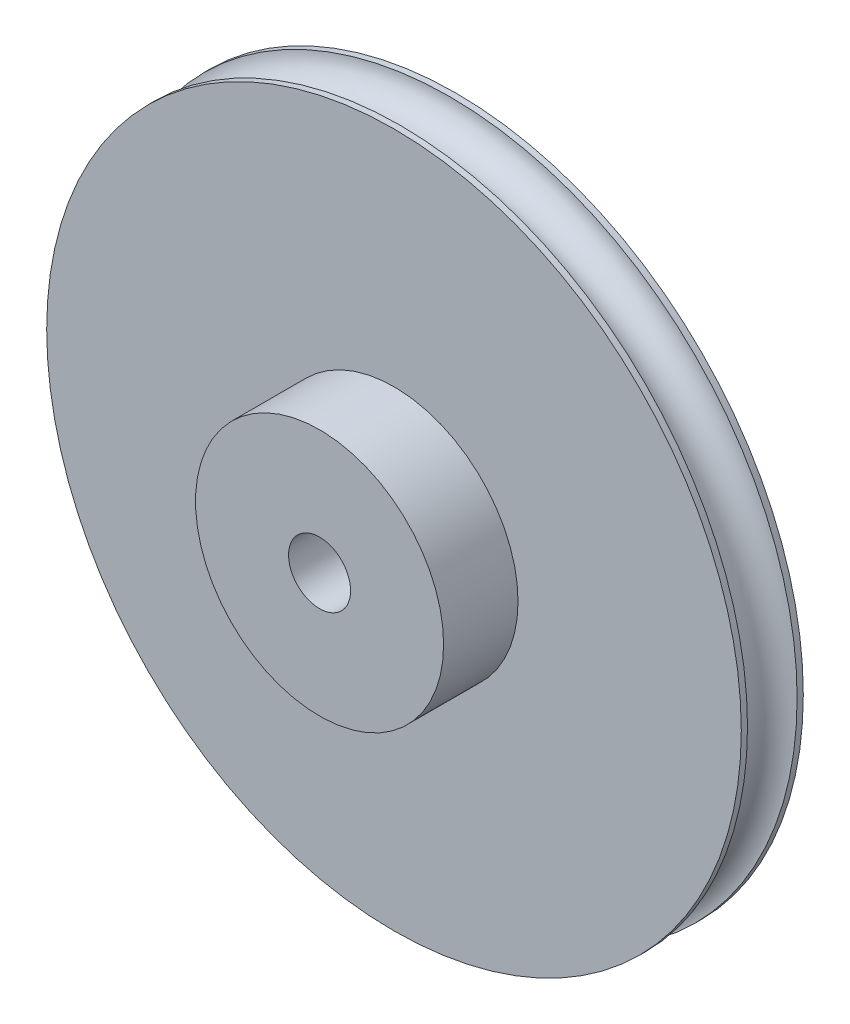
ISO-10303-21;
HEADER;
FILE_DESCRIPTION(('STEP AP214'),'2;1');
FILE_NAME('part.step','',(''),(''),'','','');
FILE_SCHEMA(('AUTOMOTIVE_DESIGN { 1 0 10303 214 1 1 1 1 }'));
ENDSEC;
DATA;
#1=APPLICATION_CONTEXT('core data for automotive mechanical design processes');
#2=APPLICATION_PROTOCOL_DEFINITION('international standard','automotive_design',2000,#1);
#3=PRODUCT_CONTEXT('',#1,'mechanical');
#4=PRODUCT('Part','Part','',(#3));
#5=PRODUCT_RELATED_PRODUCT_CATEGORY('part','',(#4));
#6=PRODUCT_DEFINITION_FORMATION('','',#4);
#7=PRODUCT_DEFINITION_CONTEXT('part definition',#1,'design');
#8=PRODUCT_DEFINITION('design','',#6,#7);
#9=PRODUCT_DEFINITION_SHAPE('','',#8);
#10=(LENGTH_UNIT() NAMED_UNIT(*) SI_UNIT(.MILLI.,.METRE.));
#11=(NAMED_UNIT(*) PLANE_ANGLE_UNIT() SI_UNIT($,.RADIAN.));
#12=(NAMED_UNIT(*) SI_UNIT($,.STERADIAN.) SOLID_ANGLE_UNIT());
#13=UNCERTAINTY_MEASURE_WITH_UNIT(LENGTH_MEASURE(1.E-05),#10,'distance_accuracy_value','');
#14=(GEOMETRIC_REPRESENTATION_CONTEXT(3) GLOBAL_UNCERTAINTY_ASSIGNED_CONTEXT((#13)) GLOBAL_UNIT_ASSIGNED_CONTEXT((#10,
#11,#12)) REPRESENTATION_CONTEXT('',''));
#15=CARTESIAN_POINT('',(0.,0.,0.));
#16=DIRECTION('',(0.,0.,1.));
#17=DIRECTION('',(1.,0.,0.));
#18=AXIS2_PLACEMENT_3D('',#15,#16,#17);
#19=CARTESIAN_POINT('',(0.,0.,5.));
#20=DIRECTION('',(0.,0.,-1.));
#21=DIRECTION('',(-1.,0.,0.));
#22=AXIS2_PLACEMENT_3D('',#19,#20,#21);
#23=CYLINDRICAL_SURFACE('',#22,28.);
#24=CARTESIAN_POINT('',(0.,0.,0.5));
#25=DIRECTION('',(0.,0.,1.));
#26=DIRECTION('',(1.,0.,0.));
#27=AXIS2_PLACEMENT_3D('',#24,#25,#26);
#28=CIRCLE('',#27,28.);
#29=CARTESIAN_POINT('',(28.,0.,0.5));
#30=VERTEX_POINT('',#29);
#31=EDGE_CURVE('E38',#30,#30,#28,.F.);
#32=ORIENTED_EDGE('',*,*,#31,.T.);
#33=EDGE_LOOP('',(#32));
#34=FACE_BOUND('',#33,.T.);
#35=CARTESIAN_POINT('',(0.,0.,0.));
#36=DIRECTION('',(0.,0.,1.));
#37=DIRECTION('',(1.,0.,0.));
#38=AXIS2_PLACEMENT_3D('',#35,#36,#37);
#39=CIRCLE('',#38,28.);
#40=CARTESIAN_POINT('',(28.,0.,0.));
#41=VERTEX_POINT('',#40);
#42=EDGE_CURVE('E47',#41,#41,#39,.T.);
#43=ORIENTED_EDGE('',*,*,#42,.T.);
#44=EDGE_LOOP('',(#43));
#45=FACE_BOUND('',#44,.T.);
#46=ADVANCED_FACE('F34',(#34,#45),#23,.T.);
#47=CARTESIAN_POINT('',(0.,0.,4.5));
#48=DIRECTION('',(0.,0.,-1.));
#49=DIRECTION('',(-1.,0.,0.));
#50=AXIS2_PLACEMENT_3D('',#47,#48,#49);
#51=CIRCLE('',#50,28.);
#52=CARTESIAN_POINT('',(-28.,0.,4.5));
#53=VERTEX_POINT('',#52);
#54=EDGE_CURVE('E54',#53,#53,#51,.F.);
#55=ORIENTED_EDGE('',*,*,#54,.T.);
#56=EDGE_LOOP('',(#55));
#57=FACE_BOUND('',#56,.T.);
#58=CARTESIAN_POINT('',(0.,0.,5.));
#59=DIRECTION('',(0.,0.,1.));
#60=DIRECTION('',(1.,0.,0.));
#61=AXIS2_PLACEMENT_3D('',#58,#59,#60);
#62=CIRCLE('',#61,28.);
#63=CARTESIAN_POINT('',(28.,0.,5.));
#64=VERTEX_POINT('',#63);
#65=EDGE_CURVE('E42',#64,#64,#62,.T.);
#66=ORIENTED_EDGE('',*,*,#65,.F.);
#67=EDGE_LOOP('',(#66));
#68=FACE_BOUND('',#67,.T.);
#69=ADVANCED_FACE('F36',(#57,#68),#23,.T.);
#70=CARTESIAN_POINT('',(0.,0.,5.));
#71=DIRECTION('',(0.,0.,1.));
#72=DIRECTION('',(1.,0.,0.));
#73=AXIS2_PLACEMENT_3D('',#70,#71,#72);
#74=PLANE('',#73);
#75=CARTESIAN_POINT('',(0.,0.,5.));
#76=DIRECTION('',(0.,0.,1.));
#77=DIRECTION('',(1.,0.,0.));
#78=AXIS2_PLACEMENT_3D('',#75,#76,#77);
#79=CIRCLE('',#78,10.);
#80=CARTESIAN_POINT('',(10.,0.,5.));
#81=VERTEX_POINT('',#80);
#82=EDGE_CURVE('E10',#81,#81,#79,.T.);
#83=ORIENTED_EDGE('',*,*,#82,.F.);
#84=EDGE_LOOP('',(#83));
#85=FACE_BOUND('',#84,.T.);
#86=ORIENTED_EDGE('',*,*,#65,.T.);
#87=EDGE_LOOP('',(#86));
#88=FACE_BOUND('',#87,.T.);
#89=ADVANCED_FACE('F86',(#85,#88),#74,.T.);
#90=CARTESIAN_POINT('',(0.,0.,0.));
#91=DIRECTION('',(0.,0.,1.));
#92=DIRECTION('',(1.,0.,0.));
#93=AXIS2_PLACEMENT_3D('',#90,#91,#92);
#94=PLANE('',#93);
#95=CARTESIAN_POINT('',(0.,0.,0.));
#96=DIRECTION('',(0.,0.,1.));
#97=DIRECTION('',(1.,0.,0.));
#98=AXIS2_PLACEMENT_3D('',#95,#96,#97);
#99=CIRCLE('',#98,2.5);
#100=CARTESIAN_POINT('',(2.5,0.,0.));
#101=VERTEX_POINT('',#100);
#102=EDGE_CURVE('E63',#101,#101,#99,.T.);
#103=ORIENTED_EDGE('',*,*,#102,.T.);
#104=EDGE_LOOP('',(#103));
#105=FACE_BOUND('',#104,.T.);
#106=ORIENTED_EDGE('',*,*,#42,.F.);
#107=EDGE_LOOP('',(#106));
#108=FACE_BOUND('',#107,.T.);
#109=ADVANCED_FACE('F77',(#105,#108),#94,.F.);
#110=CARTESIAN_POINT('',(0.,0.,11.));
#111=DIRECTION('',(0.,0.,-1.));
#112=DIRECTION('',(-1.,0.,0.));
#113=AXIS2_PLACEMENT_3D('',#110,#111,#112);
#114=CYLINDRICAL_SURFACE('',#113,10.);
#115=CARTESIAN_POINT('',(0.,0.,11.));
#116=DIRECTION('',(0.,0.,1.));
#117=DIRECTION('',(1.,0.,0.));
#118=AXIS2_PLACEMENT_3D('',#115,#116,#117);
#119=CIRCLE('',#118,10.);
#120=CARTESIAN_POINT('',(10.,0.,11.));
#121=VERTEX_POINT('',#120);
#122=EDGE_CURVE('E50',#121,#121,#119,.T.);
#123=ORIENTED_EDGE('',*,*,#122,.F.);
#124=EDGE_LOOP('',(#123));
#125=FACE_BOUND('',#124,.T.);
#126=ORIENTED_EDGE('',*,*,#82,.T.);
#127=EDGE_LOOP('',(#126));
#128=FACE_BOUND('',#127,.T.);
#129=ADVANCED_FACE('F75',(#125,#128),#114,.T.);
#130=CARTESIAN_POINT('',(0.,0.,11.));
#131=DIRECTION('',(0.,0.,1.));
#132=DIRECTION('',(1.,0.,0.));
#133=AXIS2_PLACEMENT_3D('',#130,#131,#132);
#134=PLANE('',#133);
#135=CARTESIAN_POINT('',(0.,0.,11.));
#136=DIRECTION('',(0.,0.,1.));
#137=DIRECTION('',(1.,0.,0.));
#138=AXIS2_PLACEMENT_3D('',#135,#136,#137);
#139=CIRCLE('',#138,2.5);
#140=CARTESIAN_POINT('',(2.5,0.,11.));
#141=VERTEX_POINT('',#140);
#142=EDGE_CURVE('E59',#141,#141,#139,.T.);
#143=ORIENTED_EDGE('',*,*,#142,.F.);
#144=EDGE_LOOP('',(#143));
#145=FACE_BOUND('',#144,.T.);
#146=ORIENTED_EDGE('',*,*,#122,.T.);
#147=EDGE_LOOP('',(#146));
#148=FACE_BOUND('',#147,.T.);
#149=ADVANCED_FACE('F73',(#145,#148),#134,.T.);
#150=CARTESIAN_POINT('',(0.,0.,0.));
#151=DIRECTION('',(0.,0.,1.));
#152=DIRECTION('',(1.,0.,0.));
#153=AXIS2_PLACEMENT_3D('',#150,#151,#152);
#154=CYLINDRICAL_SURFACE('',#153,2.5);
#155=ORIENTED_EDGE('',*,*,#102,.F.);
#156=EDGE_LOOP('',(#155));
#157=FACE_BOUND('',#156,.T.);
#158=ORIENTED_EDGE('',*,*,#142,.T.);
#159=EDGE_LOOP('',(#158));
#160=FACE_BOUND('',#159,.T.);
#161=ADVANCED_FACE('F83',(#157,#160),#154,.F.);
#162=CARTESIAN_POINT('',(0.,0.,2.5));
#163=DIRECTION('',(0.,0.,-1.));
#164=DIRECTION('',(-1.,0.,0.));
#165=AXIS2_PLACEMENT_3D('',#162,#163,#164);
#166=TOROIDAL_SURFACE('',#165,28.,2.);
#167=ORIENTED_EDGE('',*,*,#54,.F.);
#168=EDGE_LOOP('',(#167));
#169=FACE_BOUND('',#168,.T.);
#170=ORIENTED_EDGE('',*,*,#31,.F.);
#171=EDGE_LOOP('',(#170));
#172=FACE_BOUND('',#171,.T.);
#173=ADVANCED_FACE('F124',(#169,#172),#166,.F.);
#174=CLOSED_SHELL('',(#46,#69,#89,#109,#129,#149,#161,#173));
#175=MANIFOLD_SOLID_BREP('B2',#174);
#176=ADVANCED_BREP_SHAPE_REPRESENTATION('',(#18,#175),#14);
#177=SHAPE_DEFINITION_REPRESENTATION(#9,#176);
ENDSEC;
END-ISO-10303-21;
